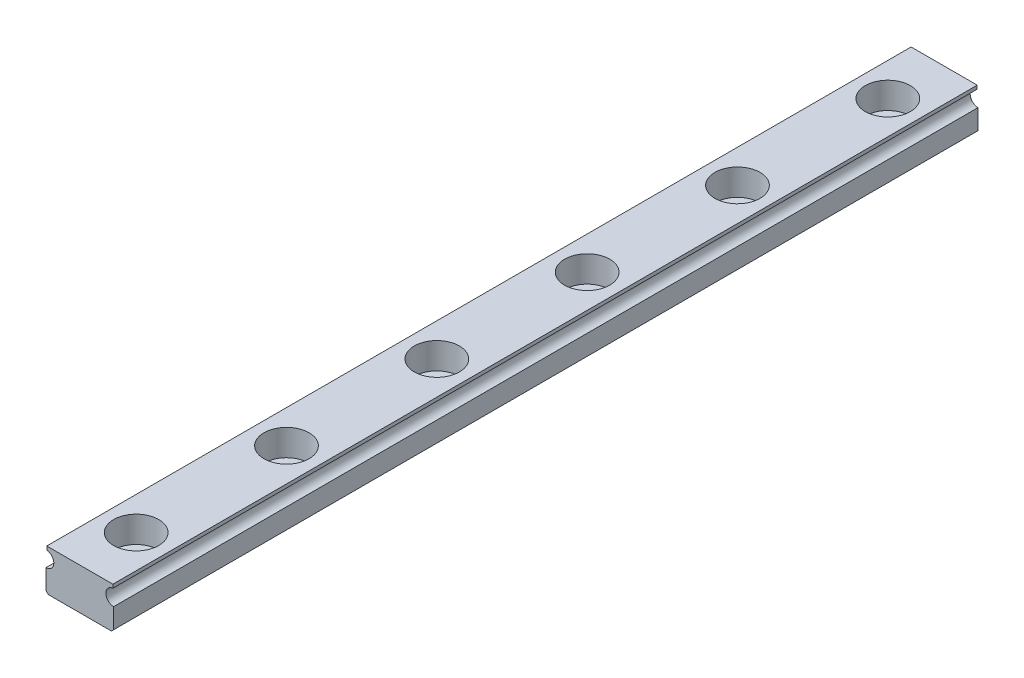
ISO-10303-21;
HEADER;
FILE_DESCRIPTION(('STEP AP214'),'2;1');
FILE_NAME('part.step','',(''),(''),'','','');
FILE_SCHEMA(('AUTOMOTIVE_DESIGN { 1 0 10303 214 1 1 1 1 }'));
ENDSEC;
DATA;
#1=APPLICATION_CONTEXT('core data for automotive mechanical design processes');
#2=APPLICATION_PROTOCOL_DEFINITION('international standard','automotive_design',2000,#1);
#3=PRODUCT_CONTEXT('',#1,'mechanical');
#4=PRODUCT('Part','Part','',(#3));
#5=PRODUCT_RELATED_PRODUCT_CATEGORY('part','',(#4));
#6=PRODUCT_DEFINITION_FORMATION('','',#4);
#7=PRODUCT_DEFINITION_CONTEXT('part definition',#1,'design');
#8=PRODUCT_DEFINITION('design','',#6,#7);
#9=PRODUCT_DEFINITION_SHAPE('','',#8);
#10=(LENGTH_UNIT() NAMED_UNIT(*) SI_UNIT(.MILLI.,.METRE.));
#11=(NAMED_UNIT(*) PLANE_ANGLE_UNIT() SI_UNIT($,.RADIAN.));
#12=(NAMED_UNIT(*) SI_UNIT($,.STERADIAN.) SOLID_ANGLE_UNIT());
#13=UNCERTAINTY_MEASURE_WITH_UNIT(LENGTH_MEASURE(1.E-05),#10,'distance_accuracy_value','');
#14=(GEOMETRIC_REPRESENTATION_CONTEXT(3) GLOBAL_UNCERTAINTY_ASSIGNED_CONTEXT((#13)) GLOBAL_UNIT_ASSIGNED_CONTEXT((#10,
#11,#12)) REPRESENTATION_CONTEXT('',''));
#15=CARTESIAN_POINT('',(0.,0.,0.));
#16=DIRECTION('',(0.,0.,1.));
#17=DIRECTION('',(1.,0.,0.));
#18=AXIS2_PLACEMENT_3D('',#15,#16,#17);
#19=CARTESIAN_POINT('',(4.5,5.5,115.));
#20=DIRECTION('',(0.,-1.,0.));
#21=DIRECTION('',(0.,0.,-1.));
#22=AXIS2_PLACEMENT_3D('',#19,#20,#21);
#23=PLANE('',#22);
#24=CARTESIAN_POINT('',(0.,5.5,47.5));
#25=DIRECTION('',(0.,1.,0.));
#26=DIRECTION('',(0.,0.,1.));
#27=AXIS2_PLACEMENT_3D('',#24,#25,#26);
#28=CIRCLE('',#27,3.);
#29=CARTESIAN_POINT('',(0.,5.5,50.5));
#30=VERTEX_POINT('',#29);
#31=EDGE_CURVE('E224',#30,#30,#28,.T.);
#32=ORIENTED_EDGE('',*,*,#31,.F.);
#33=EDGE_LOOP('',(#32));
#34=FACE_BOUND('',#33,.T.);
#35=CARTESIAN_POINT('',(0.,5.5,87.5));
#36=DIRECTION('',(0.,1.,0.));
#37=DIRECTION('',(0.,0.,1.));
#38=AXIS2_PLACEMENT_3D('',#35,#36,#37);
#39=CIRCLE('',#38,3.);
#40=CARTESIAN_POINT('',(0.,5.5,90.5));
#41=VERTEX_POINT('',#40);
#42=EDGE_CURVE('E200',#41,#41,#39,.T.);
#43=ORIENTED_EDGE('',*,*,#42,.F.);
#44=EDGE_LOOP('',(#43));
#45=FACE_BOUND('',#44,.T.);
#46=CARTESIAN_POINT('',(0.,5.5,7.5));
#47=DIRECTION('',(0.,1.,0.));
#48=DIRECTION('',(0.,0.,1.));
#49=AXIS2_PLACEMENT_3D('',#46,#47,#48);
#50=CIRCLE('',#49,3.);
#51=CARTESIAN_POINT('',(0.,5.5,10.5));
#52=VERTEX_POINT('',#51);
#53=EDGE_CURVE('E110',#52,#52,#50,.T.);
#54=ORIENTED_EDGE('',*,*,#53,.F.);
#55=EDGE_LOOP('',(#54));
#56=FACE_BOUND('',#55,.T.);
#57=DIRECTION('',(-1.,0.,0.));
#58=VECTOR('',#57,1.);
#59=CARTESIAN_POINT('',(4.5,5.5,115.));
#60=LINE('',#59,#58);
#61=CARTESIAN_POINT('',(4.4,5.5,115.));
#62=VERTEX_POINT('',#61);
#63=CARTESIAN_POINT('',(-4.4,5.5,115.));
#64=VERTEX_POINT('',#63);
#65=EDGE_CURVE('E103',#62,#64,#60,.T.);
#66=ORIENTED_EDGE('',*,*,#65,.F.);
#67=DIRECTION('',(0.,0.,1.));
#68=VECTOR('',#67,1.);
#69=CARTESIAN_POINT('',(4.4,5.5,0.));
#70=LINE('',#69,#68);
#71=CARTESIAN_POINT('',(4.4,5.5,0.));
#72=VERTEX_POINT('',#71);
#73=EDGE_CURVE('E94',#72,#62,#70,.T.);
#74=ORIENTED_EDGE('',*,*,#73,.F.);
#75=DIRECTION('',(-1.,0.,0.));
#76=VECTOR('',#75,1.);
#77=CARTESIAN_POINT('',(4.5,5.5,0.));
#78=LINE('',#77,#76);
#79=CARTESIAN_POINT('',(-4.4,5.5,0.));
#80=VERTEX_POINT('',#79);
#81=EDGE_CURVE('E39',#72,#80,#78,.T.);
#82=ORIENTED_EDGE('',*,*,#81,.T.);
#83=DIRECTION('',(0.,0.,1.));
#84=VECTOR('',#83,1.);
#85=CARTESIAN_POINT('',(-4.4,5.5,0.));
#86=LINE('',#85,#84);
#87=EDGE_CURVE('E248',#80,#64,#86,.T.);
#88=ORIENTED_EDGE('',*,*,#87,.T.);
#89=EDGE_LOOP('',(#66,#74,#82,#88));
#90=FACE_BOUND('',#89,.T.);
#91=CARTESIAN_POINT('',(0.,5.5,107.5));
#92=DIRECTION('',(0.,1.,0.));
#93=DIRECTION('',(0.,0.,1.));
#94=AXIS2_PLACEMENT_3D('',#91,#92,#93);
#95=CIRCLE('',#94,3.);
#96=CARTESIAN_POINT('',(0.,5.5,110.5));
#97=VERTEX_POINT('',#96);
#98=EDGE_CURVE('E188',#97,#97,#95,.T.);
#99=ORIENTED_EDGE('',*,*,#98,.F.);
#100=EDGE_LOOP('',(#99));
#101=FACE_BOUND('',#100,.T.);
#102=CARTESIAN_POINT('',(0.,5.5,67.5));
#103=DIRECTION('',(0.,1.,0.));
#104=DIRECTION('',(0.,0.,1.));
#105=AXIS2_PLACEMENT_3D('',#102,#103,#104);
#106=CIRCLE('',#105,3.);
#107=CARTESIAN_POINT('',(0.,5.5,70.5));
#108=VERTEX_POINT('',#107);
#109=EDGE_CURVE('E212',#108,#108,#106,.T.);
#110=ORIENTED_EDGE('',*,*,#109,.F.);
#111=EDGE_LOOP('',(#110));
#112=FACE_BOUND('',#111,.T.);
#113=CARTESIAN_POINT('',(0.,5.5,27.5));
#114=DIRECTION('',(0.,1.,0.));
#115=DIRECTION('',(0.,0.,1.));
#116=AXIS2_PLACEMENT_3D('',#113,#114,#115);
#117=CIRCLE('',#116,3.);
#118=CARTESIAN_POINT('',(0.,5.5,30.5));
#119=VERTEX_POINT('',#118);
#120=EDGE_CURVE('E236',#119,#119,#117,.T.);
#121=ORIENTED_EDGE('',*,*,#120,.F.);
#122=EDGE_LOOP('',(#121));
#123=FACE_BOUND('',#122,.T.);
#124=ADVANCED_FACE('F17',(#34,#45,#56,#90,#101,#112,#123),#23,.F.);
#125=CARTESIAN_POINT('',(-4.2030151519017,0.,115.));
#126=DIRECTION('',(0.,1.,0.));
#127=DIRECTION('',(0.,0.,1.));
#128=AXIS2_PLACEMENT_3D('',#125,#126,#127);
#129=PLANE('',#128);
#130=CARTESIAN_POINT('',(0.,0.,47.5));
#131=DIRECTION('',(0.,1.,0.));
#132=DIRECTION('',(0.,0.,1.));
#133=AXIS2_PLACEMENT_3D('',#130,#131,#132);
#134=CIRCLE('',#133,1.75);
#135=CARTESIAN_POINT('',(0.,0.,49.25));
#136=VERTEX_POINT('',#135);
#137=EDGE_CURVE('E233',#136,#136,#134,.T.);
#138=ORIENTED_EDGE('',*,*,#137,.T.);
#139=EDGE_LOOP('',(#138));
#140=FACE_BOUND('',#139,.T.);
#141=CARTESIAN_POINT('',(0.,0.,87.5));
#142=DIRECTION('',(0.,1.,0.));
#143=DIRECTION('',(0.,0.,1.));
#144=AXIS2_PLACEMENT_3D('',#141,#142,#143);
#145=CIRCLE('',#144,1.75);
#146=CARTESIAN_POINT('',(0.,0.,89.25));
#147=VERTEX_POINT('',#146);
#148=EDGE_CURVE('E209',#147,#147,#145,.T.);
#149=ORIENTED_EDGE('',*,*,#148,.T.);
#150=EDGE_LOOP('',(#149));
#151=FACE_BOUND('',#150,.T.);
#152=CARTESIAN_POINT('',(0.,0.,7.5));
#153=DIRECTION('',(0.,1.,0.));
#154=DIRECTION('',(0.,0.,1.));
#155=AXIS2_PLACEMENT_3D('',#152,#153,#154);
#156=CIRCLE('',#155,1.75);
#157=CARTESIAN_POINT('',(0.,0.,9.25));
#158=VERTEX_POINT('',#157);
#159=EDGE_CURVE('E185',#158,#158,#156,.T.);
#160=ORIENTED_EDGE('',*,*,#159,.T.);
#161=EDGE_LOOP('',(#160));
#162=FACE_BOUND('',#161,.T.);
#163=DIRECTION('',(1.,0.,0.));
#164=VECTOR('',#163,1.);
#165=CARTESIAN_POINT('',(-4.2030151519017,0.,0.));
#166=LINE('',#165,#164);
#167=CARTESIAN_POINT('',(-4.2030151519017,0.,0.));
#168=VERTEX_POINT('',#167);
#169=CARTESIAN_POINT('',(4.2030151519017,0.,0.));
#170=VERTEX_POINT('',#169);
#171=EDGE_CURVE('E124',#168,#170,#166,.T.);
#172=ORIENTED_EDGE('',*,*,#171,.T.);
#173=DIRECTION('',(0.,0.,-1.));
#174=VECTOR('',#173,1.);
#175=CARTESIAN_POINT('',(4.2030151519017,0.,115.));
#176=LINE('',#175,#174);
#177=CARTESIAN_POINT('',(4.2030151519017,0.,115.));
#178=VERTEX_POINT('',#177);
#179=EDGE_CURVE('E138',#178,#170,#176,.T.);
#180=ORIENTED_EDGE('',*,*,#179,.F.);
#181=DIRECTION('',(1.,0.,0.));
#182=VECTOR('',#181,1.);
#183=CARTESIAN_POINT('',(-4.2030151519017,0.,115.));
#184=LINE('',#183,#182);
#185=CARTESIAN_POINT('',(-4.2030151519017,0.,115.));
#186=VERTEX_POINT('',#185);
#187=EDGE_CURVE('E170',#186,#178,#184,.T.);
#188=ORIENTED_EDGE('',*,*,#187,.F.);
#189=DIRECTION('',(0.,0.,-1.));
#190=VECTOR('',#189,1.);
#191=CARTESIAN_POINT('',(-4.2030151519017,0.,115.));
#192=LINE('',#191,#190);
#193=EDGE_CURVE('E141',#186,#168,#192,.T.);
#194=ORIENTED_EDGE('',*,*,#193,.T.);
#195=EDGE_LOOP('',(#172,#180,#188,#194));
#196=FACE_BOUND('',#195,.T.);
#197=CARTESIAN_POINT('',(0.,0.,107.5));
#198=DIRECTION('',(0.,1.,0.));
#199=DIRECTION('',(0.,0.,1.));
#200=AXIS2_PLACEMENT_3D('',#197,#198,#199);
#201=CIRCLE('',#200,1.75);
#202=CARTESIAN_POINT('',(0.,0.,109.25));
#203=VERTEX_POINT('',#202);
#204=EDGE_CURVE('E197',#203,#203,#201,.T.);
#205=ORIENTED_EDGE('',*,*,#204,.T.);
#206=EDGE_LOOP('',(#205));
#207=FACE_BOUND('',#206,.T.);
#208=CARTESIAN_POINT('',(0.,0.,67.5));
#209=DIRECTION('',(0.,1.,0.));
#210=DIRECTION('',(0.,0.,1.));
#211=AXIS2_PLACEMENT_3D('',#208,#209,#210);
#212=CIRCLE('',#211,1.75);
#213=CARTESIAN_POINT('',(0.,0.,69.25));
#214=VERTEX_POINT('',#213);
#215=EDGE_CURVE('E221',#214,#214,#212,.T.);
#216=ORIENTED_EDGE('',*,*,#215,.T.);
#217=EDGE_LOOP('',(#216));
#218=FACE_BOUND('',#217,.T.);
#219=CARTESIAN_POINT('',(0.,0.,27.5));
#220=DIRECTION('',(0.,1.,0.));
#221=DIRECTION('',(0.,0.,1.));
#222=AXIS2_PLACEMENT_3D('',#219,#220,#221);
#223=CIRCLE('',#222,1.75);
#224=CARTESIAN_POINT('',(0.,0.,29.25));
#225=VERTEX_POINT('',#224);
#226=EDGE_CURVE('E245',#225,#225,#223,.T.);
#227=ORIENTED_EDGE('',*,*,#226,.T.);
#228=EDGE_LOOP('',(#227));
#229=FACE_BOUND('',#228,.T.);
#230=ADVANCED_FACE('F159',(#140,#151,#162,#196,#207,#218,#229),#129,.F.);
#231=CARTESIAN_POINT('',(-4.5,4.,115.));
#232=DIRECTION('',(0.,0.,-1.));
#233=DIRECTION('',(-1.,0.,0.));
#234=AXIS2_PLACEMENT_3D('',#231,#232,#233);
#235=CYLINDRICAL_SURFACE('',#234,1.04);
#236=CARTESIAN_POINT('',(-4.5,4.,115.));
#237=DIRECTION('',(0.,0.,-1.));
#238=DIRECTION('',(-1.,0.,0.));
#239=AXIS2_PLACEMENT_3D('',#236,#237,#238);
#240=CIRCLE('',#239,1.04);
#241=CARTESIAN_POINT('',(-4.4,5.0351811435686,115.));
#242=VERTEX_POINT('',#241);
#243=CARTESIAN_POINT('',(-4.5,2.96,115.));
#244=VERTEX_POINT('',#243);
#245=EDGE_CURVE('E177',#242,#244,#240,.T.);
#246=ORIENTED_EDGE('',*,*,#245,.F.);
#247=DIRECTION('',(0.,0.,1.));
#248=VECTOR('',#247,1.);
#249=CARTESIAN_POINT('',(-4.4,5.0351811435686,0.));
#250=LINE('',#249,#248);
#251=CARTESIAN_POINT('',(-4.4,5.0351811435686,0.));
#252=VERTEX_POINT('',#251);
#253=EDGE_CURVE('E249',#252,#242,#250,.T.);
#254=ORIENTED_EDGE('',*,*,#253,.F.);
#255=CARTESIAN_POINT('',(-4.5,4.,0.));
#256=DIRECTION('',(0.,0.,-1.));
#257=DIRECTION('',(-1.,0.,0.));
#258=AXIS2_PLACEMENT_3D('',#255,#256,#257);
#259=CIRCLE('',#258,1.04);
#260=CARTESIAN_POINT('',(-4.5,2.96,0.));
#261=VERTEX_POINT('',#260);
#262=EDGE_CURVE('E109',#252,#261,#259,.T.);
#263=ORIENTED_EDGE('',*,*,#262,.T.);
#264=DIRECTION('',(0.,0.,-1.));
#265=VECTOR('',#264,1.);
#266=CARTESIAN_POINT('',(-4.5,2.96,115.));
#267=LINE('',#266,#265);
#268=EDGE_CURVE('E11',#244,#261,#267,.T.);
#269=ORIENTED_EDGE('',*,*,#268,.F.);
#270=EDGE_LOOP('',(#246,#254,#263,#269));
#271=FACE_BOUND('',#270,.T.);
#272=ADVANCED_FACE('F281',(#271),#235,.F.);
#273=CARTESIAN_POINT('',(-4.5,2.96,115.));
#274=DIRECTION('',(1.,0.,0.));
#275=DIRECTION('',(0.,0.,-1.));
#276=AXIS2_PLACEMENT_3D('',#273,#274,#275);
#277=PLANE('',#276);
#278=DIRECTION('',(0.,-1.,0.));
#279=VECTOR('',#278,1.);
#280=CARTESIAN_POINT('',(-4.5,2.96,0.));
#281=LINE('',#280,#279);
#282=CARTESIAN_POINT('',(-4.5,0.29698484809835,0.));
#283=VERTEX_POINT('',#282);
#284=EDGE_CURVE('E112',#261,#283,#281,.T.);
#285=ORIENTED_EDGE('',*,*,#284,.T.);
#286=DIRECTION('',(0.,0.,-1.));
#287=VECTOR('',#286,1.);
#288=CARTESIAN_POINT('',(-4.5,0.29698484809835,115.));
#289=LINE('',#288,#287);
#290=CARTESIAN_POINT('',(-4.5,0.29698484809835,115.));
#291=VERTEX_POINT('',#290);
#292=EDGE_CURVE('E24',#291,#283,#289,.T.);
#293=ORIENTED_EDGE('',*,*,#292,.F.);
#294=DIRECTION('',(0.,-1.,0.));
#295=VECTOR('',#294,1.);
#296=CARTESIAN_POINT('',(-4.5,2.96,115.));
#297=LINE('',#296,#295);
#298=EDGE_CURVE('E175',#244,#291,#297,.T.);
#299=ORIENTED_EDGE('',*,*,#298,.F.);
#300=ORIENTED_EDGE('',*,*,#268,.T.);
#301=EDGE_LOOP('',(#285,#293,#299,#300));
#302=FACE_BOUND('',#301,.T.);
#303=ADVANCED_FACE('F538',(#302),#277,.F.);
#304=CARTESIAN_POINT('',(-4.5,0.29698484809835,115.));
#305=DIRECTION('',(0.707106781186607,0.707106781186488,0.));
#306=DIRECTION('',(-0.707106781186488,0.707106781186607,0.));
#307=AXIS2_PLACEMENT_3D('',#304,#305,#306);
#308=PLANE('',#307);
#309=DIRECTION('',(0.707106781186488,-0.707106781186607,0.));
#310=VECTOR('',#309,1.);
#311=CARTESIAN_POINT('',(-4.5,0.29698484809835,0.));
#312=LINE('',#311,#310);
#313=EDGE_CURVE('E122',#283,#168,#312,.T.);
#314=ORIENTED_EDGE('',*,*,#313,.T.);
#315=ORIENTED_EDGE('',*,*,#193,.F.);
#316=DIRECTION('',(0.707106781186488,-0.707106781186607,0.));
#317=VECTOR('',#316,1.);
#318=CARTESIAN_POINT('',(-4.5,0.29698484809835,115.));
#319=LINE('',#318,#317);
#320=EDGE_CURVE('E150',#291,#186,#319,.T.);
#321=ORIENTED_EDGE('',*,*,#320,.F.);
#322=ORIENTED_EDGE('',*,*,#292,.T.);
#323=EDGE_LOOP('',(#314,#315,#321,#322));
#324=FACE_BOUND('',#323,.T.);
#325=ADVANCED_FACE('F148',(#324),#308,.F.);
#326=CARTESIAN_POINT('',(4.2030151519017,0.,115.));
#327=DIRECTION('',(-0.707106781186607,0.707106781186488,0.));
#328=DIRECTION('',(-0.707106781186488,-0.707106781186607,0.));
#329=AXIS2_PLACEMENT_3D('',#326,#327,#328);
#330=PLANE('',#329);
#331=DIRECTION('',(0.707106781186488,0.707106781186607,0.));
#332=VECTOR('',#331,1.);
#333=CARTESIAN_POINT('',(4.2030151519017,0.,0.));
#334=LINE('',#333,#332);
#335=CARTESIAN_POINT('',(4.5,0.29698484809835,0.));
#336=VERTEX_POINT('',#335);
#337=EDGE_CURVE('E126',#170,#336,#334,.T.);
#338=ORIENTED_EDGE('',*,*,#337,.T.);
#339=DIRECTION('',(0.,0.,-1.));
#340=VECTOR('',#339,1.);
#341=CARTESIAN_POINT('',(4.5,0.29698484809835,115.));
#342=LINE('',#341,#340);
#343=CARTESIAN_POINT('',(4.5,0.29698484809835,115.));
#344=VERTEX_POINT('',#343);
#345=EDGE_CURVE('E135',#344,#336,#342,.T.);
#346=ORIENTED_EDGE('',*,*,#345,.F.);
#347=DIRECTION('',(0.707106781186488,0.707106781186607,0.));
#348=VECTOR('',#347,1.);
#349=CARTESIAN_POINT('',(4.2030151519017,0.,115.));
#350=LINE('',#349,#348);
#351=EDGE_CURVE('E166',#178,#344,#350,.T.);
#352=ORIENTED_EDGE('',*,*,#351,.F.);
#353=ORIENTED_EDGE('',*,*,#179,.T.);
#354=EDGE_LOOP('',(#338,#346,#352,#353));
#355=FACE_BOUND('',#354,.T.);
#356=ADVANCED_FACE('F164',(#355),#330,.F.);
#357=CARTESIAN_POINT('',(4.5,0.29698484809835,115.));
#358=DIRECTION('',(-1.,0.,0.));
#359=DIRECTION('',(0.,0.,1.));
#360=AXIS2_PLACEMENT_3D('',#357,#358,#359);
#361=PLANE('',#360);
#362=DIRECTION('',(0.,1.,0.));
#363=VECTOR('',#362,1.);
#364=CARTESIAN_POINT('',(4.5,0.29698484809835,0.));
#365=LINE('',#364,#363);
#366=CARTESIAN_POINT('',(4.5,2.96,0.));
#367=VERTEX_POINT('',#366);
#368=EDGE_CURVE('E128',#336,#367,#365,.T.);
#369=ORIENTED_EDGE('',*,*,#368,.T.);
#370=DIRECTION('',(0.,0.,-1.));
#371=VECTOR('',#370,1.);
#372=CARTESIAN_POINT('',(4.5,2.96,115.));
#373=LINE('',#372,#371);
#374=CARTESIAN_POINT('',(4.5,2.96,115.));
#375=VERTEX_POINT('',#374);
#376=EDGE_CURVE('E132',#375,#367,#373,.T.);
#377=ORIENTED_EDGE('',*,*,#376,.F.);
#378=DIRECTION('',(0.,1.,0.));
#379=VECTOR('',#378,1.);
#380=CARTESIAN_POINT('',(4.5,0.29698484809835,115.));
#381=LINE('',#380,#379);
#382=EDGE_CURVE('E169',#344,#375,#381,.T.);
#383=ORIENTED_EDGE('',*,*,#382,.F.);
#384=ORIENTED_EDGE('',*,*,#345,.T.);
#385=EDGE_LOOP('',(#369,#377,#383,#384));
#386=FACE_BOUND('',#385,.T.);
#387=ADVANCED_FACE('F264',(#386),#361,.F.);
#388=CARTESIAN_POINT('',(4.5,4.,115.));
#389=DIRECTION('',(0.,0.,-1.));
#390=DIRECTION('',(-1.,0.,0.));
#391=AXIS2_PLACEMENT_3D('',#388,#389,#390);
#392=CYLINDRICAL_SURFACE('',#391,1.04);
#393=CARTESIAN_POINT('',(4.5,4.,0.));
#394=DIRECTION('',(0.,0.,-1.));
#395=DIRECTION('',(-1.,0.,0.));
#396=AXIS2_PLACEMENT_3D('',#393,#394,#395);
#397=CIRCLE('',#396,1.04);
#398=CARTESIAN_POINT('',(4.4,5.0351811435686,0.));
#399=VERTEX_POINT('',#398);
#400=EDGE_CURVE('E130',#367,#399,#397,.T.);
#401=ORIENTED_EDGE('',*,*,#400,.T.);
#402=DIRECTION('',(0.,0.,1.));
#403=VECTOR('',#402,1.);
#404=CARTESIAN_POINT('',(4.4,5.0351811435686,0.));
#405=LINE('',#404,#403);
#406=CARTESIAN_POINT('',(4.4,5.0351811435686,115.));
#407=VERTEX_POINT('',#406);
#408=EDGE_CURVE('E31',#399,#407,#405,.T.);
#409=ORIENTED_EDGE('',*,*,#408,.T.);
#410=CARTESIAN_POINT('',(4.5,4.,115.));
#411=DIRECTION('',(0.,0.,-1.));
#412=DIRECTION('',(-1.,0.,0.));
#413=AXIS2_PLACEMENT_3D('',#410,#411,#412);
#414=CIRCLE('',#413,1.04);
#415=EDGE_CURVE('E118',#375,#407,#414,.T.);
#416=ORIENTED_EDGE('',*,*,#415,.F.);
#417=ORIENTED_EDGE('',*,*,#376,.T.);
#418=EDGE_LOOP('',(#401,#409,#416,#417));
#419=FACE_BOUND('',#418,.T.);
#420=ADVANCED_FACE('F260',(#419),#392,.F.);
#421=CARTESIAN_POINT('',(-4.5,4.,115.));
#422=DIRECTION('',(0.,0.,-1.));
#423=DIRECTION('',(-1.,0.,0.));
#424=AXIS2_PLACEMENT_3D('',#421,#422,#423);
#425=PLANE('',#424);
#426=ORIENTED_EDGE('',*,*,#415,.T.);
#427=DIRECTION('',(0.,-1.,0.));
#428=VECTOR('',#427,1.);
#429=CARTESIAN_POINT('',(4.4,5.0351811435686,115.));
#430=LINE('',#429,#428);
#431=EDGE_CURVE('E99',#62,#407,#430,.T.);
#432=ORIENTED_EDGE('',*,*,#431,.F.);
#433=ORIENTED_EDGE('',*,*,#65,.T.);
#434=DIRECTION('',(0.,1.,0.));
#435=VECTOR('',#434,1.);
#436=CARTESIAN_POINT('',(-4.4,5.0351811435686,115.));
#437=LINE('',#436,#435);
#438=EDGE_CURVE('E252',#242,#64,#437,.T.);
#439=ORIENTED_EDGE('',*,*,#438,.F.);
#440=ORIENTED_EDGE('',*,*,#245,.T.);
#441=ORIENTED_EDGE('',*,*,#298,.T.);
#442=ORIENTED_EDGE('',*,*,#320,.T.);
#443=ORIENTED_EDGE('',*,*,#187,.T.);
#444=ORIENTED_EDGE('',*,*,#351,.T.);
#445=ORIENTED_EDGE('',*,*,#382,.T.);
#446=EDGE_LOOP('',(#426,#432,#433,#439,#440,#441,#442,#443,#444,#445));
#447=FACE_BOUND('',#446,.T.);
#448=ADVANCED_FACE('F261',(#447),#425,.F.);
#449=CARTESIAN_POINT('',(-4.5,4.,0.));
#450=DIRECTION('',(0.,0.,-1.));
#451=DIRECTION('',(-1.,0.,0.));
#452=AXIS2_PLACEMENT_3D('',#449,#450,#451);
#453=PLANE('',#452);
#454=DIRECTION('',(0.,-1.,0.));
#455=VECTOR('',#454,1.);
#456=CARTESIAN_POINT('',(4.4,5.0351811435686,0.));
#457=LINE('',#456,#455);
#458=EDGE_CURVE('E92',#72,#399,#457,.T.);
#459=ORIENTED_EDGE('',*,*,#458,.T.);
#460=ORIENTED_EDGE('',*,*,#400,.F.);
#461=ORIENTED_EDGE('',*,*,#368,.F.);
#462=ORIENTED_EDGE('',*,*,#337,.F.);
#463=ORIENTED_EDGE('',*,*,#171,.F.);
#464=ORIENTED_EDGE('',*,*,#313,.F.);
#465=ORIENTED_EDGE('',*,*,#284,.F.);
#466=ORIENTED_EDGE('',*,*,#262,.F.);
#467=DIRECTION('',(0.,1.,0.));
#468=VECTOR('',#467,1.);
#469=CARTESIAN_POINT('',(-4.4,5.0351811435686,0.));
#470=LINE('',#469,#468);
#471=EDGE_CURVE('E108',#252,#80,#470,.T.);
#472=ORIENTED_EDGE('',*,*,#471,.T.);
#473=ORIENTED_EDGE('',*,*,#81,.F.);
#474=EDGE_LOOP('',(#459,#460,#461,#462,#463,#464,#465,#466,#472,#473));
#475=FACE_BOUND('',#474,.T.);
#476=ADVANCED_FACE('F106',(#475),#453,.T.);
#477=CARTESIAN_POINT('',(0.,0.,7.5));
#478=DIRECTION('',(0.,1.,0.));
#479=DIRECTION('',(0.,0.,1.));
#480=AXIS2_PLACEMENT_3D('',#477,#478,#479);
#481=CYLINDRICAL_SURFACE('',#480,3.);
#482=ORIENTED_EDGE('',*,*,#53,.T.);
#483=EDGE_LOOP('',(#482));
#484=FACE_BOUND('',#483,.T.);
#485=CARTESIAN_POINT('',(0.,2.,7.5));
#486=DIRECTION('',(0.,1.,0.));
#487=DIRECTION('',(0.,0.,1.));
#488=AXIS2_PLACEMENT_3D('',#485,#486,#487);
#489=CIRCLE('',#488,3.);
#490=CARTESIAN_POINT('',(0.,2.,10.5));
#491=VERTEX_POINT('',#490);
#492=EDGE_CURVE('E115',#491,#491,#489,.T.);
#493=ORIENTED_EDGE('',*,*,#492,.F.);
#494=EDGE_LOOP('',(#493));
#495=FACE_BOUND('',#494,.T.);
#496=ADVANCED_FACE('F290',(#484,#495),#481,.F.);
#497=CARTESIAN_POINT('',(0.,2.,4.5));
#498=DIRECTION('',(0.,1.,0.));
#499=DIRECTION('',(0.,0.,1.));
#500=AXIS2_PLACEMENT_3D('',#497,#498,#499);
#501=PLANE('',#500);
#502=ORIENTED_EDGE('',*,*,#492,.T.);
#503=EDGE_LOOP('',(#502));
#504=FACE_BOUND('',#503,.T.);
#505=CARTESIAN_POINT('',(0.,2.,7.5));
#506=DIRECTION('',(0.,1.,0.));
#507=DIRECTION('',(0.,0.,1.));
#508=AXIS2_PLACEMENT_3D('',#505,#506,#507);
#509=CIRCLE('',#508,1.75);
#510=CARTESIAN_POINT('',(0.,2.,9.25));
#511=VERTEX_POINT('',#510);
#512=EDGE_CURVE('E182',#511,#511,#509,.T.);
#513=ORIENTED_EDGE('',*,*,#512,.F.);
#514=EDGE_LOOP('',(#513));
#515=FACE_BOUND('',#514,.T.);
#516=ADVANCED_FACE('F293',(#504,#515),#501,.T.);
#517=CARTESIAN_POINT('',(0.,0.,7.5));
#518=DIRECTION('',(0.,1.,0.));
#519=DIRECTION('',(0.,0.,1.));
#520=AXIS2_PLACEMENT_3D('',#517,#518,#519);
#521=CYLINDRICAL_SURFACE('',#520,1.75);
#522=ORIENTED_EDGE('',*,*,#512,.T.);
#523=EDGE_LOOP('',(#522));
#524=FACE_BOUND('',#523,.T.);
#525=ORIENTED_EDGE('',*,*,#159,.F.);
#526=EDGE_LOOP('',(#525));
#527=FACE_BOUND('',#526,.T.);
#528=ADVANCED_FACE('F299',(#524,#527),#521,.F.);
#529=CARTESIAN_POINT('',(0.,0.,107.5));
#530=DIRECTION('',(0.,1.,0.));
#531=DIRECTION('',(0.,0.,1.));
#532=AXIS2_PLACEMENT_3D('',#529,#530,#531);
#533=CYLINDRICAL_SURFACE('',#532,3.);
#534=ORIENTED_EDGE('',*,*,#98,.T.);
#535=EDGE_LOOP('',(#534));
#536=FACE_BOUND('',#535,.T.);
#537=CARTESIAN_POINT('',(0.,2.,107.5));
#538=DIRECTION('',(0.,1.,0.));
#539=DIRECTION('',(0.,0.,1.));
#540=AXIS2_PLACEMENT_3D('',#537,#538,#539);
#541=CIRCLE('',#540,3.);
#542=CARTESIAN_POINT('',(0.,2.,110.5));
#543=VERTEX_POINT('',#542);
#544=EDGE_CURVE('E191',#543,#543,#541,.T.);
#545=ORIENTED_EDGE('',*,*,#544,.F.);
#546=EDGE_LOOP('',(#545));
#547=FACE_BOUND('',#546,.T.);
#548=ADVANCED_FACE('F305',(#536,#547),#533,.F.);
#549=CARTESIAN_POINT('',(0.,2.,104.5));
#550=DIRECTION('',(0.,1.,0.));
#551=DIRECTION('',(0.,0.,1.));
#552=AXIS2_PLACEMENT_3D('',#549,#550,#551);
#553=PLANE('',#552);
#554=ORIENTED_EDGE('',*,*,#544,.T.);
#555=EDGE_LOOP('',(#554));
#556=FACE_BOUND('',#555,.T.);
#557=CARTESIAN_POINT('',(0.,2.,107.5));
#558=DIRECTION('',(0.,1.,0.));
#559=DIRECTION('',(0.,0.,1.));
#560=AXIS2_PLACEMENT_3D('',#557,#558,#559);
#561=CIRCLE('',#560,1.75);
#562=CARTESIAN_POINT('',(0.,2.,109.25));
#563=VERTEX_POINT('',#562);
#564=EDGE_CURVE('E194',#563,#563,#561,.T.);
#565=ORIENTED_EDGE('',*,*,#564,.F.);
#566=EDGE_LOOP('',(#565));
#567=FACE_BOUND('',#566,.T.);
#568=ADVANCED_FACE('F313',(#556,#567),#553,.T.);
#569=CARTESIAN_POINT('',(0.,0.,107.5));
#570=DIRECTION('',(0.,1.,0.));
#571=DIRECTION('',(0.,0.,1.));
#572=AXIS2_PLACEMENT_3D('',#569,#570,#571);
#573=CYLINDRICAL_SURFACE('',#572,1.75);
#574=ORIENTED_EDGE('',*,*,#564,.T.);
#575=EDGE_LOOP('',(#574));
#576=FACE_BOUND('',#575,.T.);
#577=ORIENTED_EDGE('',*,*,#204,.F.);
#578=EDGE_LOOP('',(#577));
#579=FACE_BOUND('',#578,.T.);
#580=ADVANCED_FACE('F360',(#576,#579),#573,.F.);
#581=CARTESIAN_POINT('',(0.,0.,87.5));
#582=DIRECTION('',(0.,1.,0.));
#583=DIRECTION('',(0.,0.,1.));
#584=AXIS2_PLACEMENT_3D('',#581,#582,#583);
#585=CYLINDRICAL_SURFACE('',#584,3.);
#586=ORIENTED_EDGE('',*,*,#42,.T.);
#587=EDGE_LOOP('',(#586));
#588=FACE_BOUND('',#587,.T.);
#589=CARTESIAN_POINT('',(0.,2.,87.5));
#590=DIRECTION('',(0.,1.,0.));
#591=DIRECTION('',(0.,0.,1.));
#592=AXIS2_PLACEMENT_3D('',#589,#590,#591);
#593=CIRCLE('',#592,3.);
#594=CARTESIAN_POINT('',(0.,2.,90.5));
#595=VERTEX_POINT('',#594);
#596=EDGE_CURVE('E203',#595,#595,#593,.T.);
#597=ORIENTED_EDGE('',*,*,#596,.F.);
#598=EDGE_LOOP('',(#597));
#599=FACE_BOUND('',#598,.T.);
#600=ADVANCED_FACE('F370',(#588,#599),#585,.F.);
#601=CARTESIAN_POINT('',(0.,2.,84.5));
#602=DIRECTION('',(0.,1.,0.));
#603=DIRECTION('',(0.,0.,1.));
#604=AXIS2_PLACEMENT_3D('',#601,#602,#603);
#605=PLANE('',#604);
#606=ORIENTED_EDGE('',*,*,#596,.T.);
#607=EDGE_LOOP('',(#606));
#608=FACE_BOUND('',#607,.T.);
#609=CARTESIAN_POINT('',(0.,2.,87.5));
#610=DIRECTION('',(0.,1.,0.));
#611=DIRECTION('',(0.,0.,1.));
#612=AXIS2_PLACEMENT_3D('',#609,#610,#611);
#613=CIRCLE('',#612,1.75);
#614=CARTESIAN_POINT('',(0.,2.,89.25));
#615=VERTEX_POINT('',#614);
#616=EDGE_CURVE('E206',#615,#615,#613,.T.);
#617=ORIENTED_EDGE('',*,*,#616,.F.);
#618=EDGE_LOOP('',(#617));
#619=FACE_BOUND('',#618,.T.);
#620=ADVANCED_FACE('F380',(#608,#619),#605,.T.);
#621=CARTESIAN_POINT('',(0.,0.,87.5));
#622=DIRECTION('',(0.,1.,0.));
#623=DIRECTION('',(0.,0.,1.));
#624=AXIS2_PLACEMENT_3D('',#621,#622,#623);
#625=CYLINDRICAL_SURFACE('',#624,1.75);
#626=ORIENTED_EDGE('',*,*,#616,.T.);
#627=EDGE_LOOP('',(#626));
#628=FACE_BOUND('',#627,.T.);
#629=ORIENTED_EDGE('',*,*,#148,.F.);
#630=EDGE_LOOP('',(#629));
#631=FACE_BOUND('',#630,.T.);
#632=ADVANCED_FACE('F390',(#628,#631),#625,.F.);
#633=CARTESIAN_POINT('',(0.,0.,67.5));
#634=DIRECTION('',(0.,1.,0.));
#635=DIRECTION('',(0.,0.,1.));
#636=AXIS2_PLACEMENT_3D('',#633,#634,#635);
#637=CYLINDRICAL_SURFACE('',#636,3.);
#638=ORIENTED_EDGE('',*,*,#109,.T.);
#639=EDGE_LOOP('',(#638));
#640=FACE_BOUND('',#639,.T.);
#641=CARTESIAN_POINT('',(0.,2.,67.5));
#642=DIRECTION('',(0.,1.,0.));
#643=DIRECTION('',(0.,0.,1.));
#644=AXIS2_PLACEMENT_3D('',#641,#642,#643);
#645=CIRCLE('',#644,3.);
#646=CARTESIAN_POINT('',(0.,2.,70.5));
#647=VERTEX_POINT('',#646);
#648=EDGE_CURVE('E215',#647,#647,#645,.T.);
#649=ORIENTED_EDGE('',*,*,#648,.F.);
#650=EDGE_LOOP('',(#649));
#651=FACE_BOUND('',#650,.T.);
#652=ADVANCED_FACE('F400',(#640,#651),#637,.F.);
#653=CARTESIAN_POINT('',(0.,2.,64.5));
#654=DIRECTION('',(0.,1.,0.));
#655=DIRECTION('',(0.,0.,1.));
#656=AXIS2_PLACEMENT_3D('',#653,#654,#655);
#657=PLANE('',#656);
#658=ORIENTED_EDGE('',*,*,#648,.T.);
#659=EDGE_LOOP('',(#658));
#660=FACE_BOUND('',#659,.T.);
#661=CARTESIAN_POINT('',(0.,2.,67.5));
#662=DIRECTION('',(0.,1.,0.));
#663=DIRECTION('',(0.,0.,1.));
#664=AXIS2_PLACEMENT_3D('',#661,#662,#663);
#665=CIRCLE('',#664,1.75);
#666=CARTESIAN_POINT('',(0.,2.,69.25));
#667=VERTEX_POINT('',#666);
#668=EDGE_CURVE('E218',#667,#667,#665,.T.);
#669=ORIENTED_EDGE('',*,*,#668,.F.);
#670=EDGE_LOOP('',(#669));
#671=FACE_BOUND('',#670,.T.);
#672=ADVANCED_FACE('F410',(#660,#671),#657,.T.);
#673=CARTESIAN_POINT('',(0.,0.,67.5));
#674=DIRECTION('',(0.,1.,0.));
#675=DIRECTION('',(0.,0.,1.));
#676=AXIS2_PLACEMENT_3D('',#673,#674,#675);
#677=CYLINDRICAL_SURFACE('',#676,1.75);
#678=ORIENTED_EDGE('',*,*,#668,.T.);
#679=EDGE_LOOP('',(#678));
#680=FACE_BOUND('',#679,.T.);
#681=ORIENTED_EDGE('',*,*,#215,.F.);
#682=EDGE_LOOP('',(#681));
#683=FACE_BOUND('',#682,.T.);
#684=ADVANCED_FACE('F420',(#680,#683),#677,.F.);
#685=CARTESIAN_POINT('',(0.,0.,47.5));
#686=DIRECTION('',(0.,1.,0.));
#687=DIRECTION('',(0.,0.,1.));
#688=AXIS2_PLACEMENT_3D('',#685,#686,#687);
#689=CYLINDRICAL_SURFACE('',#688,3.);
#690=ORIENTED_EDGE('',*,*,#31,.T.);
#691=EDGE_LOOP('',(#690));
#692=FACE_BOUND('',#691,.T.);
#693=CARTESIAN_POINT('',(0.,2.,47.5));
#694=DIRECTION('',(0.,1.,0.));
#695=DIRECTION('',(0.,0.,1.));
#696=AXIS2_PLACEMENT_3D('',#693,#694,#695);
#697=CIRCLE('',#696,3.);
#698=CARTESIAN_POINT('',(0.,2.,50.5));
#699=VERTEX_POINT('',#698);
#700=EDGE_CURVE('E227',#699,#699,#697,.T.);
#701=ORIENTED_EDGE('',*,*,#700,.F.);
#702=EDGE_LOOP('',(#701));
#703=FACE_BOUND('',#702,.T.);
#704=ADVANCED_FACE('F430',(#692,#703),#689,.F.);
#705=CARTESIAN_POINT('',(0.,2.,44.5));
#706=DIRECTION('',(0.,1.,0.));
#707=DIRECTION('',(0.,0.,1.));
#708=AXIS2_PLACEMENT_3D('',#705,#706,#707);
#709=PLANE('',#708);
#710=ORIENTED_EDGE('',*,*,#700,.T.);
#711=EDGE_LOOP('',(#710));
#712=FACE_BOUND('',#711,.T.);
#713=CARTESIAN_POINT('',(0.,2.,47.5));
#714=DIRECTION('',(0.,1.,0.));
#715=DIRECTION('',(0.,0.,1.));
#716=AXIS2_PLACEMENT_3D('',#713,#714,#715);
#717=CIRCLE('',#716,1.75);
#718=CARTESIAN_POINT('',(0.,2.,49.25));
#719=VERTEX_POINT('',#718);
#720=EDGE_CURVE('E230',#719,#719,#717,.T.);
#721=ORIENTED_EDGE('',*,*,#720,.F.);
#722=EDGE_LOOP('',(#721));
#723=FACE_BOUND('',#722,.T.);
#724=ADVANCED_FACE('F440',(#712,#723),#709,.T.);
#725=CARTESIAN_POINT('',(0.,0.,47.5));
#726=DIRECTION('',(0.,1.,0.));
#727=DIRECTION('',(0.,0.,1.));
#728=AXIS2_PLACEMENT_3D('',#725,#726,#727);
#729=CYLINDRICAL_SURFACE('',#728,1.75);
#730=ORIENTED_EDGE('',*,*,#720,.T.);
#731=EDGE_LOOP('',(#730));
#732=FACE_BOUND('',#731,.T.);
#733=ORIENTED_EDGE('',*,*,#137,.F.);
#734=EDGE_LOOP('',(#733));
#735=FACE_BOUND('',#734,.T.);
#736=ADVANCED_FACE('F450',(#732,#735),#729,.F.);
#737=CARTESIAN_POINT('',(0.,0.,27.5));
#738=DIRECTION('',(0.,1.,0.));
#739=DIRECTION('',(0.,0.,1.));
#740=AXIS2_PLACEMENT_3D('',#737,#738,#739);
#741=CYLINDRICAL_SURFACE('',#740,3.);
#742=ORIENTED_EDGE('',*,*,#120,.T.);
#743=EDGE_LOOP('',(#742));
#744=FACE_BOUND('',#743,.T.);
#745=CARTESIAN_POINT('',(0.,2.,27.5));
#746=DIRECTION('',(0.,1.,0.));
#747=DIRECTION('',(0.,0.,1.));
#748=AXIS2_PLACEMENT_3D('',#745,#746,#747);
#749=CIRCLE('',#748,3.);
#750=CARTESIAN_POINT('',(0.,2.,30.5));
#751=VERTEX_POINT('',#750);
#752=EDGE_CURVE('E239',#751,#751,#749,.T.);
#753=ORIENTED_EDGE('',*,*,#752,.F.);
#754=EDGE_LOOP('',(#753));
#755=FACE_BOUND('',#754,.T.);
#756=ADVANCED_FACE('F460',(#744,#755),#741,.F.);
#757=CARTESIAN_POINT('',(0.,2.,24.5));
#758=DIRECTION('',(0.,1.,0.));
#759=DIRECTION('',(0.,0.,1.));
#760=AXIS2_PLACEMENT_3D('',#757,#758,#759);
#761=PLANE('',#760);
#762=ORIENTED_EDGE('',*,*,#752,.T.);
#763=EDGE_LOOP('',(#762));
#764=FACE_BOUND('',#763,.T.);
#765=CARTESIAN_POINT('',(0.,2.,27.5));
#766=DIRECTION('',(0.,1.,0.));
#767=DIRECTION('',(0.,0.,1.));
#768=AXIS2_PLACEMENT_3D('',#765,#766,#767);
#769=CIRCLE('',#768,1.75);
#770=CARTESIAN_POINT('',(0.,2.,29.25));
#771=VERTEX_POINT('',#770);
#772=EDGE_CURVE('E242',#771,#771,#769,.T.);
#773=ORIENTED_EDGE('',*,*,#772,.F.);
#774=EDGE_LOOP('',(#773));
#775=FACE_BOUND('',#774,.T.);
#776=ADVANCED_FACE('F470',(#764,#775),#761,.T.);
#777=CARTESIAN_POINT('',(0.,0.,27.5));
#778=DIRECTION('',(0.,1.,0.));
#779=DIRECTION('',(0.,0.,1.));
#780=AXIS2_PLACEMENT_3D('',#777,#778,#779);
#781=CYLINDRICAL_SURFACE('',#780,1.75);
#782=ORIENTED_EDGE('',*,*,#772,.T.);
#783=EDGE_LOOP('',(#782));
#784=FACE_BOUND('',#783,.T.);
#785=ORIENTED_EDGE('',*,*,#226,.F.);
#786=EDGE_LOOP('',(#785));
#787=FACE_BOUND('',#786,.T.);
#788=ADVANCED_FACE('F480',(#784,#787),#781,.F.);
#789=CARTESIAN_POINT('',(-4.4,5.0351811435686,0.));
#790=DIRECTION('',(1.,0.,0.));
#791=DIRECTION('',(0.,0.,-1.));
#792=AXIS2_PLACEMENT_3D('',#789,#790,#791);
#793=PLANE('',#792);
#794=ORIENTED_EDGE('',*,*,#438,.T.);
#795=ORIENTED_EDGE('',*,*,#87,.F.);
#796=ORIENTED_EDGE('',*,*,#471,.F.);
#797=ORIENTED_EDGE('',*,*,#253,.T.);
#798=EDGE_LOOP('',(#794,#795,#796,#797));
#799=FACE_BOUND('',#798,.T.);
#800=ADVANCED_FACE('F490',(#799),#793,.F.);
#801=CARTESIAN_POINT('',(4.4,5.0351811435686,0.));
#802=DIRECTION('',(-1.,0.,0.));
#803=DIRECTION('',(0.,0.,1.));
#804=AXIS2_PLACEMENT_3D('',#801,#802,#803);
#805=PLANE('',#804);
#806=ORIENTED_EDGE('',*,*,#431,.T.);
#807=ORIENTED_EDGE('',*,*,#408,.F.);
#808=ORIENTED_EDGE('',*,*,#458,.F.);
#809=ORIENTED_EDGE('',*,*,#73,.T.);
#810=EDGE_LOOP('',(#806,#807,#808,#809));
#811=FACE_BOUND('',#810,.T.);
#812=ADVANCED_FACE('F93',(#811),#805,.F.);
#813=CLOSED_SHELL('',(#124,#230,#272,#303,#325,#356,#387,#420,#448,#476,#496,#516,#528,#548,
#568,#580,#600,#620,#632,#652,#672,#684,#704,#724,#736,#756,#776,#788,#800,#812));
#814=MANIFOLD_SOLID_BREP('B1',#813);
#815=ADVANCED_BREP_SHAPE_REPRESENTATION('',(#18,#814),#14);
#816=SHAPE_DEFINITION_REPRESENTATION(#9,#815);
ENDSEC;
END-ISO-10303-21;
